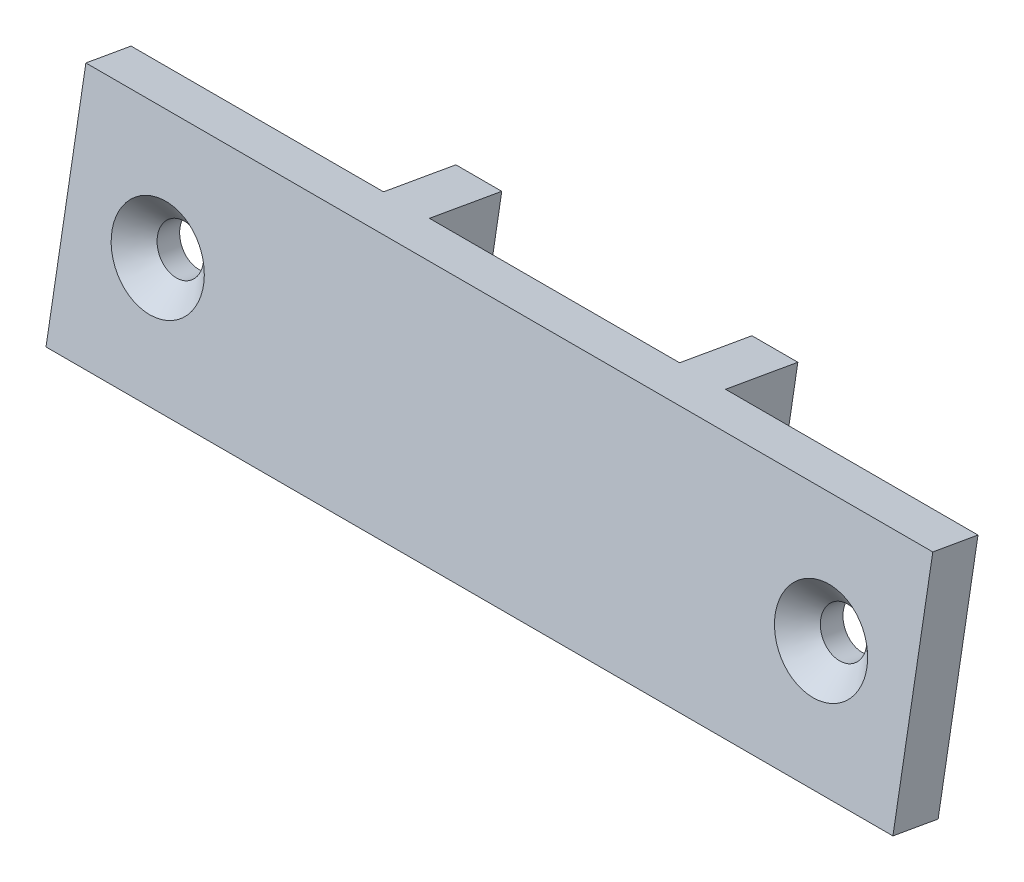
ISO-10303-21;
HEADER;
FILE_DESCRIPTION(('STEP AP214'),'2;1');
FILE_NAME('part.step','',(''),(''),'','','');
FILE_SCHEMA(('AUTOMOTIVE_DESIGN { 1 0 10303 214 1 1 1 1 }'));
ENDSEC;
DATA;
#1=APPLICATION_CONTEXT('core data for automotive mechanical design processes');
#2=APPLICATION_PROTOCOL_DEFINITION('international standard','automotive_design',2000,#1);
#3=PRODUCT_CONTEXT('',#1,'mechanical');
#4=PRODUCT('Part','Part','',(#3));
#5=PRODUCT_RELATED_PRODUCT_CATEGORY('part','',(#4));
#6=PRODUCT_DEFINITION_FORMATION('','',#4);
#7=PRODUCT_DEFINITION_CONTEXT('part definition',#1,'design');
#8=PRODUCT_DEFINITION('design','',#6,#7);
#9=PRODUCT_DEFINITION_SHAPE('','',#8);
#10=(LENGTH_UNIT() NAMED_UNIT(*) SI_UNIT(.MILLI.,.METRE.));
#11=(NAMED_UNIT(*) PLANE_ANGLE_UNIT() SI_UNIT($,.RADIAN.));
#12=(NAMED_UNIT(*) SI_UNIT($,.STERADIAN.) SOLID_ANGLE_UNIT());
#13=UNCERTAINTY_MEASURE_WITH_UNIT(LENGTH_MEASURE(1.E-05),#10,'distance_accuracy_value','');
#14=(GEOMETRIC_REPRESENTATION_CONTEXT(3) GLOBAL_UNCERTAINTY_ASSIGNED_CONTEXT((#13)) GLOBAL_UNIT_ASSIGNED_CONTEXT((#10,
#11,#12)) REPRESENTATION_CONTEXT('',''));
#15=CARTESIAN_POINT('',(0.,0.,0.));
#16=DIRECTION('',(0.,0.,1.));
#17=DIRECTION('',(1.,0.,0.));
#18=AXIS2_PLACEMENT_3D('',#15,#16,#17);
#19=CARTESIAN_POINT('',(0.,-1.580198416769,-8.96175055241111));
#20=DIRECTION('',(0.,0.173648177666923,0.984807753012209));
#21=DIRECTION('',(0.,-0.984807753012209,0.173648177666923));
#22=AXIS2_PLACEMENT_3D('',#19,#20,#21);
#23=PLANE('',#22);
#24=CARTESIAN_POINT('',(14.45,6.88914825913601,-10.4551248803466));
#25=DIRECTION('',(0.,0.173648177666923,0.984807753012209));
#26=DIRECTION('',(0.,-0.984807753012209,0.173648177666923));
#27=AXIS2_PLACEMENT_3D('',#24,#25,#26);
#28=CIRCLE('',#27,1.);
#29=CARTESIAN_POINT('',(14.45,5.9043405061238,-10.2814767026797));
#30=VERTEX_POINT('',#29);
#31=EDGE_CURVE('E197',#30,#30,#28,.T.);
#32=ORIENTED_EDGE('',*,*,#31,.T.);
#33=EDGE_LOOP('',(#32));
#34=FACE_BOUND('',#33,.T.);
#35=DIRECTION('',(0.,-0.984807753012209,0.173648177666923));
#36=VECTOR('',#35,1.);
#37=CARTESIAN_POINT('',(7.45,11.8131870241971,-11.3233657686813));
#38=LINE('',#37,#36);
#39=CARTESIAN_POINT('',(7.45,11.8131870241971,-11.3233657686813));
#40=VERTEX_POINT('',#39);
#41=CARTESIAN_POINT('',(7.45,1.96510949407496,-9.58688399201203));
#42=VERTEX_POINT('',#41);
#43=EDGE_CURVE('E162',#40,#42,#38,.T.);
#44=ORIENTED_EDGE('',*,*,#43,.F.);
#45=DIRECTION('',(-1.,0.,0.));
#46=VECTOR('',#45,1.);
#47=CARTESIAN_POINT('',(-18.45,11.8131870241971,-11.3233657686813));
#48=LINE('',#47,#46);
#49=CARTESIAN_POINT('',(18.45,11.8131870241971,-11.3233657686813));
#50=VERTEX_POINT('',#49);
#51=EDGE_CURVE('E214',#50,#40,#48,.T.);
#52=ORIENTED_EDGE('',*,*,#51,.F.);
#53=DIRECTION('',(0.,0.984807753012209,-0.173648177666923));
#54=VECTOR('',#53,1.);
#55=CARTESIAN_POINT('',(18.45,11.8131870241971,-11.3233657686813));
#56=LINE('',#55,#54);
#57=CARTESIAN_POINT('',(18.45,1.96510949407496,-9.58688399201203));
#58=VERTEX_POINT('',#57);
#59=EDGE_CURVE('E209',#58,#50,#56,.T.);
#60=ORIENTED_EDGE('',*,*,#59,.F.);
#61=DIRECTION('',(1.,0.,0.));
#62=VECTOR('',#61,1.);
#63=CARTESIAN_POINT('',(-18.45,1.96510949407496,-9.58688399201203));
#64=LINE('',#63,#62);
#65=EDGE_CURVE('E57',#42,#58,#64,.T.);
#66=ORIENTED_EDGE('',*,*,#65,.F.);
#67=EDGE_LOOP('',(#44,#52,#60,#66));
#68=FACE_BOUND('',#67,.T.);
#69=ADVANCED_FACE('F41',(#34,#68),#23,.F.);
#70=DIRECTION('',(0.,0.984807753012209,-0.173648177666923));
#71=VECTOR('',#70,1.);
#72=CARTESIAN_POINT('',(5.45,11.8131870241971,-11.3233657686813));
#73=LINE('',#72,#71);
#74=CARTESIAN_POINT('',(5.45,1.96510949407496,-9.58688399201203));
#75=VERTEX_POINT('',#74);
#76=CARTESIAN_POINT('',(5.45,11.8131870241971,-11.3233657686813));
#77=VERTEX_POINT('',#76);
#78=EDGE_CURVE('E65',#75,#77,#73,.T.);
#79=ORIENTED_EDGE('',*,*,#78,.F.);
#80=CARTESIAN_POINT('',(-5.45,1.96510949407496,-9.58688399201203));
#81=VERTEX_POINT('',#80);
#82=EDGE_CURVE('E210',#81,#75,#64,.T.);
#83=ORIENTED_EDGE('',*,*,#82,.F.);
#84=DIRECTION('',(0.,-0.984807753012209,0.173648177666923));
#85=VECTOR('',#84,1.);
#86=CARTESIAN_POINT('',(-5.45,1.96510949407496,-9.58688399201203));
#87=LINE('',#86,#85);
#88=CARTESIAN_POINT('',(-5.45,11.8131870241971,-11.3233657686813));
#89=VERTEX_POINT('',#88);
#90=EDGE_CURVE('E178',#89,#81,#87,.T.);
#91=ORIENTED_EDGE('',*,*,#90,.F.);
#92=EDGE_CURVE('E216',#77,#89,#48,.T.);
#93=ORIENTED_EDGE('',*,*,#92,.F.);
#94=EDGE_LOOP('',(#79,#83,#91,#93));
#95=FACE_BOUND('',#94,.T.);
#96=ADVANCED_FACE('F255',(#95),#23,.F.);
#97=CARTESIAN_POINT('',(-14.45,6.889148259136,-10.4551248803466));
#98=DIRECTION('',(0.,0.173648177666923,0.984807753012209));
#99=DIRECTION('',(0.,-0.984807753012209,0.173648177666923));
#100=AXIS2_PLACEMENT_3D('',#97,#98,#99);
#101=CIRCLE('',#100,1.);
#102=CARTESIAN_POINT('',(-14.45,5.90434050612379,-10.2814767026797));
#103=VERTEX_POINT('',#102);
#104=EDGE_CURVE('E278',#103,#103,#101,.F.);
#105=ORIENTED_EDGE('',*,*,#104,.F.);
#106=EDGE_LOOP('',(#105));
#107=FACE_BOUND('',#106,.T.);
#108=DIRECTION('',(0.,0.984807753012209,-0.173648177666923));
#109=VECTOR('',#108,1.);
#110=CARTESIAN_POINT('',(-7.45,1.96510949407496,-9.58688399201203));
#111=LINE('',#110,#109);
#112=CARTESIAN_POINT('',(-7.45,1.96510949407496,-9.58688399201203));
#113=VERTEX_POINT('',#112);
#114=CARTESIAN_POINT('',(-7.45,11.8131870241971,-11.3233657686813));
#115=VERTEX_POINT('',#114);
#116=EDGE_CURVE('E174',#113,#115,#111,.T.);
#117=ORIENTED_EDGE('',*,*,#116,.F.);
#118=CARTESIAN_POINT('',(-18.45,1.96510949407496,-9.58688399201203));
#119=VERTEX_POINT('',#118);
#120=EDGE_CURVE('E206',#119,#113,#64,.T.);
#121=ORIENTED_EDGE('',*,*,#120,.F.);
#122=DIRECTION('',(0.,-0.984807753012209,0.173648177666923));
#123=VECTOR('',#122,1.);
#124=CARTESIAN_POINT('',(-18.45,11.8131870241971,-11.3233657686813));
#125=LINE('',#124,#123);
#126=CARTESIAN_POINT('',(-18.45,11.8131870241971,-11.3233657686813));
#127=VERTEX_POINT('',#126);
#128=EDGE_CURVE('E202',#127,#119,#125,.T.);
#129=ORIENTED_EDGE('',*,*,#128,.F.);
#130=EDGE_CURVE('E213',#115,#127,#48,.T.);
#131=ORIENTED_EDGE('',*,*,#130,.F.);
#132=EDGE_LOOP('',(#117,#121,#129,#131));
#133=FACE_BOUND('',#132,.T.);
#134=ADVANCED_FACE('F258',(#107,#133),#23,.F.);
#135=CARTESIAN_POINT('',(-18.45,11.8131870241971,-11.3233657686813));
#136=DIRECTION('',(-1.,0.,0.));
#137=DIRECTION('',(0.,0.,1.));
#138=AXIS2_PLACEMENT_3D('',#135,#136,#137);
#139=PLANE('',#138);
#140=DIRECTION('',(0.,-0.984807753012209,0.173648177666923));
#141=VECTOR('',#140,1.);
#142=CARTESIAN_POINT('',(-18.45,12.1604833795309,-9.35375026265685));
#143=LINE('',#142,#141);
#144=CARTESIAN_POINT('',(-18.45,12.1604833795309,-9.35375026265685));
#145=VERTEX_POINT('',#144);
#146=CARTESIAN_POINT('',(-18.45,2.31240584940881,-7.61726848598761));
#147=VERTEX_POINT('',#146);
#148=EDGE_CURVE('E155',#145,#147,#143,.T.);
#149=ORIENTED_EDGE('',*,*,#148,.F.);
#150=DIRECTION('',(0.,0.173648177666923,0.984807753012209));
#151=VECTOR('',#150,1.);
#152=CARTESIAN_POINT('',(-18.45,11.8131870241971,-11.3233657686813));
#153=LINE('',#152,#151);
#154=EDGE_CURVE('E225',#127,#145,#153,.T.);
#155=ORIENTED_EDGE('',*,*,#154,.F.);
#156=ORIENTED_EDGE('',*,*,#128,.T.);
#157=DIRECTION('',(0.,0.173648177666923,0.984807753012209));
#158=VECTOR('',#157,1.);
#159=CARTESIAN_POINT('',(-18.45,1.96510949407496,-9.58688399201203));
#160=LINE('',#159,#158);
#161=EDGE_CURVE('E215',#119,#147,#160,.T.);
#162=ORIENTED_EDGE('',*,*,#161,.T.);
#163=EDGE_LOOP('',(#149,#155,#156,#162));
#164=FACE_BOUND('',#163,.T.);
#165=ADVANCED_FACE('F267',(#164),#139,.T.);
#166=CARTESIAN_POINT('',(-18.45,11.8131870241971,-11.3233657686813));
#167=DIRECTION('',(0.,0.984807753012209,-0.173648177666923));
#168=DIRECTION('',(0.,0.173648177666923,0.984807753012209));
#169=AXIS2_PLACEMENT_3D('',#166,#167,#168);
#170=PLANE('',#169);
#171=DIRECTION('',(-1.,0.,0.));
#172=VECTOR('',#171,1.);
#173=CARTESIAN_POINT('',(-18.45,12.1604833795309,-9.35375026265685));
#174=LINE('',#173,#172);
#175=CARTESIAN_POINT('',(18.45,12.1604833795309,-9.35375026265685));
#176=VERTEX_POINT('',#175);
#177=EDGE_CURVE('E205',#176,#145,#174,.T.);
#178=ORIENTED_EDGE('',*,*,#177,.F.);
#179=DIRECTION('',(0.,0.173648177666923,0.984807753012209));
#180=VECTOR('',#179,1.);
#181=CARTESIAN_POINT('',(18.45,11.8131870241971,-11.3233657686813));
#182=LINE('',#181,#180);
#183=EDGE_CURVE('E228',#50,#176,#182,.T.);
#184=ORIENTED_EDGE('',*,*,#183,.F.);
#185=ORIENTED_EDGE('',*,*,#51,.T.);
#186=DIRECTION('',(0.,0.173648177666923,0.984807753012209));
#187=VECTOR('',#186,1.);
#188=CARTESIAN_POINT('',(7.45,9.22616969631558,-25.9950701073321));
#189=LINE('',#188,#187);
#190=CARTESIAN_POINT('',(7.45,11.2575128556629,-14.4747505783203));
#191=VERTEX_POINT('',#190);
#192=EDGE_CURVE('E146',#191,#40,#189,.T.);
#193=ORIENTED_EDGE('',*,*,#192,.F.);
#194=DIRECTION('',(1.,0.,0.));
#195=VECTOR('',#194,1.);
#196=CARTESIAN_POINT('',(7.45,11.2575128556629,-14.4747505783203));
#197=LINE('',#196,#195);
#198=CARTESIAN_POINT('',(5.45,11.2575128556629,-14.4747505783203));
#199=VERTEX_POINT('',#198);
#200=EDGE_CURVE('E139',#199,#191,#197,.T.);
#201=ORIENTED_EDGE('',*,*,#200,.F.);
#202=DIRECTION('',(0.,0.173648177666923,0.984807753012209));
#203=VECTOR('',#202,1.);
#204=CARTESIAN_POINT('',(5.45,9.22616969631558,-25.9950701073321));
#205=LINE('',#204,#203);
#206=EDGE_CURVE('E130',#199,#77,#205,.T.);
#207=ORIENTED_EDGE('',*,*,#206,.T.);
#208=ORIENTED_EDGE('',*,*,#92,.T.);
#209=DIRECTION('',(0.,0.173648177666923,0.984807753012209));
#210=VECTOR('',#209,1.);
#211=CARTESIAN_POINT('',(-5.45,9.22616969631558,-25.9950701073321));
#212=LINE('',#211,#210);
#213=CARTESIAN_POINT('',(-5.45,11.2575128556629,-14.4747505783203));
#214=VERTEX_POINT('',#213);
#215=EDGE_CURVE('E180',#214,#89,#212,.T.);
#216=ORIENTED_EDGE('',*,*,#215,.F.);
#217=DIRECTION('',(1.,0.,0.));
#218=VECTOR('',#217,1.);
#219=CARTESIAN_POINT('',(-7.45,11.2575128556629,-14.4747505783203));
#220=LINE('',#219,#218);
#221=CARTESIAN_POINT('',(-7.45,11.2575128556629,-14.4747505783203));
#222=VERTEX_POINT('',#221);
#223=EDGE_CURVE('E191',#222,#214,#220,.T.);
#224=ORIENTED_EDGE('',*,*,#223,.F.);
#225=DIRECTION('',(0.,0.173648177666923,0.984807753012209));
#226=VECTOR('',#225,1.);
#227=CARTESIAN_POINT('',(-7.45,9.22616969631558,-25.9950701073321));
#228=LINE('',#227,#226);
#229=EDGE_CURVE('E183',#222,#115,#228,.T.);
#230=ORIENTED_EDGE('',*,*,#229,.T.);
#231=ORIENTED_EDGE('',*,*,#130,.T.);
#232=ORIENTED_EDGE('',*,*,#154,.T.);
#233=EDGE_LOOP('',(#178,#184,#185,#193,#201,#207,#208,#216,#224,#230,#231,#232));
#234=FACE_BOUND('',#233,.T.);
#235=ADVANCED_FACE('F143',(#234),#170,.T.);
#236=CARTESIAN_POINT('',(18.45,11.8131870241971,-11.3233657686813));
#237=DIRECTION('',(1.,0.,0.));
#238=DIRECTION('',(0.,0.,-1.));
#239=AXIS2_PLACEMENT_3D('',#236,#237,#238);
#240=PLANE('',#239);
#241=DIRECTION('',(0.,0.984807753012209,-0.173648177666923));
#242=VECTOR('',#241,1.);
#243=CARTESIAN_POINT('',(18.45,12.1604833795309,-9.35375026265685));
#244=LINE('',#243,#242);
#245=CARTESIAN_POINT('',(18.45,2.31240584940881,-7.61726848598761));
#246=VERTEX_POINT('',#245);
#247=EDGE_CURVE('E220',#246,#176,#244,.T.);
#248=ORIENTED_EDGE('',*,*,#247,.F.);
#249=DIRECTION('',(0.,0.173648177666923,0.984807753012209));
#250=VECTOR('',#249,1.);
#251=CARTESIAN_POINT('',(18.45,1.96510949407496,-9.58688399201203));
#252=LINE('',#251,#250);
#253=EDGE_CURVE('E230',#58,#246,#252,.T.);
#254=ORIENTED_EDGE('',*,*,#253,.F.);
#255=ORIENTED_EDGE('',*,*,#59,.T.);
#256=ORIENTED_EDGE('',*,*,#183,.T.);
#257=EDGE_LOOP('',(#248,#254,#255,#256));
#258=FACE_BOUND('',#257,.T.);
#259=ADVANCED_FACE('F301',(#258),#240,.T.);
#260=CARTESIAN_POINT('',(-18.45,1.96510949407496,-9.58688399201203));
#261=DIRECTION('',(0.,-0.984807753012209,0.173648177666923));
#262=DIRECTION('',(0.,-0.173648177666923,-0.984807753012209));
#263=AXIS2_PLACEMENT_3D('',#260,#261,#262);
#264=PLANE('',#263);
#265=DIRECTION('',(1.,0.,0.));
#266=VECTOR('',#265,1.);
#267=CARTESIAN_POINT('',(-18.45,2.31240584940881,-7.61726848598761));
#268=LINE('',#267,#266);
#269=EDGE_CURVE('E158',#147,#246,#268,.T.);
#270=ORIENTED_EDGE('',*,*,#269,.F.);
#271=ORIENTED_EDGE('',*,*,#161,.F.);
#272=ORIENTED_EDGE('',*,*,#120,.T.);
#273=DIRECTION('',(0.,0.173648177666923,0.984807753012209));
#274=VECTOR('',#273,1.);
#275=CARTESIAN_POINT('',(-7.45,-0.621907833806521,-24.2585883306629));
#276=LINE('',#275,#274);
#277=CARTESIAN_POINT('',(-7.45,1.4094353255408,-12.7382688016511));
#278=VERTEX_POINT('',#277);
#279=EDGE_CURVE('E171',#278,#113,#276,.T.);
#280=ORIENTED_EDGE('',*,*,#279,.F.);
#281=DIRECTION('',(-1.,0.,0.));
#282=VECTOR('',#281,1.);
#283=CARTESIAN_POINT('',(-7.45,1.4094353255408,-12.7382688016511));
#284=LINE('',#283,#282);
#285=CARTESIAN_POINT('',(-5.45,1.4094353255408,-12.7382688016511));
#286=VERTEX_POINT('',#285);
#287=EDGE_CURVE('E179',#286,#278,#284,.T.);
#288=ORIENTED_EDGE('',*,*,#287,.F.);
#289=DIRECTION('',(0.,0.173648177666923,0.984807753012209));
#290=VECTOR('',#289,1.);
#291=CARTESIAN_POINT('',(-5.45,-0.621907833806523,-24.2585883306629));
#292=LINE('',#291,#290);
#293=EDGE_CURVE('E175',#286,#81,#292,.T.);
#294=ORIENTED_EDGE('',*,*,#293,.T.);
#295=ORIENTED_EDGE('',*,*,#82,.T.);
#296=DIRECTION('',(0.,0.173648177666923,0.984807753012209));
#297=VECTOR('',#296,1.);
#298=CARTESIAN_POINT('',(5.45,-0.621907833806523,-24.2585883306629));
#299=LINE('',#298,#297);
#300=CARTESIAN_POINT('',(5.45,1.4094353255408,-12.7382688016511));
#301=VERTEX_POINT('',#300);
#302=EDGE_CURVE('E168',#301,#75,#299,.T.);
#303=ORIENTED_EDGE('',*,*,#302,.F.);
#304=DIRECTION('',(-1.,0.,0.));
#305=VECTOR('',#304,1.);
#306=CARTESIAN_POINT('',(7.45,1.4094353255408,-12.7382688016511));
#307=LINE('',#306,#305);
#308=CARTESIAN_POINT('',(7.45,1.4094353255408,-12.7382688016511));
#309=VERTEX_POINT('',#308);
#310=EDGE_CURVE('E154',#309,#301,#307,.T.);
#311=ORIENTED_EDGE('',*,*,#310,.F.);
#312=DIRECTION('',(0.,0.173648177666923,0.984807753012209));
#313=VECTOR('',#312,1.);
#314=CARTESIAN_POINT('',(7.45,-0.621907833806524,-24.2585883306629));
#315=LINE('',#314,#313);
#316=EDGE_CURVE('E166',#309,#42,#315,.T.);
#317=ORIENTED_EDGE('',*,*,#316,.T.);
#318=ORIENTED_EDGE('',*,*,#65,.T.);
#319=ORIENTED_EDGE('',*,*,#253,.T.);
#320=EDGE_LOOP('',(#270,#271,#272,#280,#288,#294,#295,#303,#311,#317,#318,#319));
#321=FACE_BOUND('',#320,.T.);
#322=ADVANCED_FACE('F285',(#321),#264,.T.);
#323=CARTESIAN_POINT('',(0.,-1.23290206143516,-6.99213504638669));
#324=DIRECTION('',(0.,0.173648177666923,0.984807753012209));
#325=DIRECTION('',(0.,-0.984807753012209,0.173648177666923));
#326=AXIS2_PLACEMENT_3D('',#323,#324,#325);
#327=PLANE('',#326);
#328=CARTESIAN_POINT('',(-14.45,7.23644461446985,-8.48550937432223));
#329=DIRECTION('',(0.,0.173648177666923,0.984807753012209));
#330=DIRECTION('',(0.,-0.984807753012209,0.173648177666923));
#331=AXIS2_PLACEMENT_3D('',#328,#329,#330);
#332=CIRCLE('',#331,2.00000000000002);
#333=CARTESIAN_POINT('',(-14.45,5.26682910844541,-8.13821301898838));
#334=VERTEX_POINT('',#333);
#335=EDGE_CURVE('E50',#334,#334,#332,.F.);
#336=ORIENTED_EDGE('',*,*,#335,.T.);
#337=EDGE_LOOP('',(#336));
#338=FACE_BOUND('',#337,.T.);
#339=CARTESIAN_POINT('',(14.45,7.23644461446985,-8.48550937432223));
#340=DIRECTION('',(0.,0.173648177666923,0.984807753012209));
#341=DIRECTION('',(0.,-0.984807753012209,0.173648177666923));
#342=AXIS2_PLACEMENT_3D('',#339,#340,#341);
#343=CIRCLE('',#342,2.00000000000003);
#344=CARTESIAN_POINT('',(14.45,5.26682910844541,-8.13821301898838));
#345=VERTEX_POINT('',#344);
#346=EDGE_CURVE('E235',#345,#345,#343,.F.);
#347=ORIENTED_EDGE('',*,*,#346,.T.);
#348=EDGE_LOOP('',(#347));
#349=FACE_BOUND('',#348,.T.);
#350=ORIENTED_EDGE('',*,*,#148,.T.);
#351=ORIENTED_EDGE('',*,*,#269,.T.);
#352=ORIENTED_EDGE('',*,*,#247,.T.);
#353=ORIENTED_EDGE('',*,*,#177,.T.);
#354=EDGE_LOOP('',(#350,#351,#352,#353));
#355=FACE_BOUND('',#354,.T.);
#356=ADVANCED_FACE('F240',(#338,#349,#355),#327,.T.);
#357=CARTESIAN_POINT('',(-7.45,-0.621907833806521,-24.2585883306629));
#358=DIRECTION('',(1.,0.,0.));
#359=DIRECTION('',(0.,1.,0.));
#360=AXIS2_PLACEMENT_3D('',#357,#358,#359);
#361=PLANE('',#360);
#362=DIRECTION('',(0.,0.984807753012209,-0.173648177666923));
#363=VECTOR('',#362,1.);
#364=CARTESIAN_POINT('',(-7.45,1.4094353255408,-12.7382688016511));
#365=LINE('',#364,#363);
#366=EDGE_CURVE('E188',#278,#222,#365,.T.);
#367=ORIENTED_EDGE('',*,*,#366,.F.);
#368=ORIENTED_EDGE('',*,*,#279,.T.);
#369=ORIENTED_EDGE('',*,*,#116,.T.);
#370=ORIENTED_EDGE('',*,*,#229,.F.);
#371=EDGE_LOOP('',(#367,#368,#369,#370));
#372=FACE_BOUND('',#371,.T.);
#373=ADVANCED_FACE('F288',(#372),#361,.F.);
#374=CARTESIAN_POINT('',(-5.45,-0.621907833806523,-24.2585883306629));
#375=DIRECTION('',(-1.,0.,0.));
#376=DIRECTION('',(0.,-1.,0.));
#377=AXIS2_PLACEMENT_3D('',#374,#375,#376);
#378=PLANE('',#377);
#379=DIRECTION('',(0.,-0.984807753012209,0.173648177666923));
#380=VECTOR('',#379,1.);
#381=CARTESIAN_POINT('',(-5.45,1.4094353255408,-12.7382688016511));
#382=LINE('',#381,#380);
#383=EDGE_CURVE('E194',#214,#286,#382,.T.);
#384=ORIENTED_EDGE('',*,*,#383,.F.);
#385=ORIENTED_EDGE('',*,*,#215,.T.);
#386=ORIENTED_EDGE('',*,*,#90,.T.);
#387=ORIENTED_EDGE('',*,*,#293,.F.);
#388=EDGE_LOOP('',(#384,#385,#386,#387));
#389=FACE_BOUND('',#388,.T.);
#390=ADVANCED_FACE('F292',(#389),#378,.F.);
#391=CARTESIAN_POINT('',(-10.45,-21.3888641566918,-8.71831348866182));
#392=DIRECTION('',(0.,-0.173648177666923,-0.984807753012209));
#393=DIRECTION('',(0.,0.984807753012209,-0.173648177666923));
#394=AXIS2_PLACEMENT_3D('',#391,#392,#393);
#395=PLANE('',#394);
#396=ORIENTED_EDGE('',*,*,#287,.T.);
#397=ORIENTED_EDGE('',*,*,#366,.T.);
#398=ORIENTED_EDGE('',*,*,#223,.T.);
#399=ORIENTED_EDGE('',*,*,#383,.T.);
#400=EDGE_LOOP('',(#396,#397,#398,#399));
#401=FACE_BOUND('',#400,.T.);
#402=ADVANCED_FACE('F290',(#401),#395,.T.);
#403=CARTESIAN_POINT('',(7.45,9.22616969631558,-25.9950701073321));
#404=DIRECTION('',(-1.,0.,0.));
#405=DIRECTION('',(0.,-1.,0.));
#406=AXIS2_PLACEMENT_3D('',#403,#404,#405);
#407=PLANE('',#406);
#408=DIRECTION('',(0.,-0.984807753012209,0.173648177666923));
#409=VECTOR('',#408,1.);
#410=CARTESIAN_POINT('',(7.45,11.2575128556629,-14.4747505783203));
#411=LINE('',#410,#409);
#412=EDGE_CURVE('E150',#191,#309,#411,.T.);
#413=ORIENTED_EDGE('',*,*,#412,.F.);
#414=ORIENTED_EDGE('',*,*,#192,.T.);
#415=ORIENTED_EDGE('',*,*,#43,.T.);
#416=ORIENTED_EDGE('',*,*,#316,.F.);
#417=EDGE_LOOP('',(#413,#414,#415,#416));
#418=FACE_BOUND('',#417,.T.);
#419=ADVANCED_FACE('F305',(#418),#407,.F.);
#420=CARTESIAN_POINT('',(5.45,9.22616969631558,-25.9950701073321));
#421=DIRECTION('',(1.,0.,0.));
#422=DIRECTION('',(0.,1.,0.));
#423=AXIS2_PLACEMENT_3D('',#420,#421,#422);
#424=PLANE('',#423);
#425=DIRECTION('',(0.,0.984807753012209,-0.173648177666923));
#426=VECTOR('',#425,1.);
#427=CARTESIAN_POINT('',(5.45,11.2575128556629,-14.4747505783203));
#428=LINE('',#427,#426);
#429=EDGE_CURVE('E135',#301,#199,#428,.T.);
#430=ORIENTED_EDGE('',*,*,#429,.F.);
#431=ORIENTED_EDGE('',*,*,#302,.T.);
#432=ORIENTED_EDGE('',*,*,#78,.T.);
#433=ORIENTED_EDGE('',*,*,#206,.F.);
#434=EDGE_LOOP('',(#430,#431,#432,#433));
#435=FACE_BOUND('',#434,.T.);
#436=ADVANCED_FACE('F132',(#435),#424,.F.);
#437=CARTESIAN_POINT('',(-10.45,-21.3888641566918,-8.71831348866182));
#438=DIRECTION('',(0.,-0.173648177666923,-0.984807753012209));
#439=DIRECTION('',(0.,0.984807753012209,-0.173648177666923));
#440=AXIS2_PLACEMENT_3D('',#437,#438,#439);
#441=PLANE('',#440);
#442=ORIENTED_EDGE('',*,*,#200,.T.);
#443=ORIENTED_EDGE('',*,*,#412,.T.);
#444=ORIENTED_EDGE('',*,*,#310,.T.);
#445=ORIENTED_EDGE('',*,*,#429,.T.);
#446=EDGE_LOOP('',(#442,#443,#444,#445));
#447=FACE_BOUND('',#446,.T.);
#448=ADVANCED_FACE('F153',(#447),#441,.T.);
#449=CARTESIAN_POINT('',(14.45,-3.77074927897298,-70.9104079872143));
#450=DIRECTION('',(0.,0.173648177666923,0.984807753012209));
#451=DIRECTION('',(0.,-0.984807753012209,0.173648177666923));
#452=AXIS2_PLACEMENT_3D('',#449,#450,#451);
#453=CYLINDRICAL_SURFACE('',#452,1.);
#454=CARTESIAN_POINT('',(14.45,7.06279643680292,-9.47031712733448));
#455=DIRECTION('',(0.,0.173648177666923,0.984807753012209));
#456=DIRECTION('',(0.,-0.984807753012209,0.173648177666923));
#457=AXIS2_PLACEMENT_3D('',#454,#455,#456);
#458=CIRCLE('',#457,1.);
#459=CARTESIAN_POINT('',(14.45,6.07798868379071,-9.29666894966755));
#460=VERTEX_POINT('',#459);
#461=EDGE_CURVE('E227',#460,#460,#458,.T.);
#462=ORIENTED_EDGE('',*,*,#461,.T.);
#463=EDGE_LOOP('',(#462));
#464=FACE_BOUND('',#463,.T.);
#465=ORIENTED_EDGE('',*,*,#31,.F.);
#466=EDGE_LOOP('',(#465));
#467=FACE_BOUND('',#466,.T.);
#468=ADVANCED_FACE('F318',(#464,#467),#453,.F.);
#469=CARTESIAN_POINT('',(14.45,7.06279643680292,-9.47031712733447));
#470=DIRECTION('',(0.,0.173648177666923,0.984807753012209));
#471=DIRECTION('',(0.,-0.984807753012209,0.173648177666923));
#472=AXIS2_PLACEMENT_3D('',#469,#470,#471);
#473=CONICAL_SURFACE('',#472,1.,0.785398163397446);
#474=ORIENTED_EDGE('',*,*,#346,.F.);
#475=EDGE_LOOP('',(#474));
#476=FACE_BOUND('',#475,.T.);
#477=ORIENTED_EDGE('',*,*,#461,.F.);
#478=EDGE_LOOP('',(#477));
#479=FACE_BOUND('',#478,.T.);
#480=ADVANCED_FACE('F250',(#476,#479),#473,.F.);
#481=CARTESIAN_POINT('',(-14.45,6.03651821753245,-15.290630134153));
#482=DIRECTION('',(0.,0.173648177666923,0.984807753012209));
#483=DIRECTION('',(0.,-0.984807753012209,0.173648177666923));
#484=AXIS2_PLACEMENT_3D('',#481,#482,#483);
#485=CYLINDRICAL_SURFACE('',#484,1.);
#486=CARTESIAN_POINT('',(-14.45,7.06279643680293,-9.47031712733445));
#487=DIRECTION('',(0.,0.173648177666924,0.984807753012209));
#488=DIRECTION('',(0.,-0.984807753012209,0.173648177666924));
#489=AXIS2_PLACEMENT_3D('',#486,#487,#488);
#490=CIRCLE('',#489,1.);
#491=CARTESIAN_POINT('',(-14.45,6.07798868379072,-9.29666894966752));
#492=VERTEX_POINT('',#491);
#493=EDGE_CURVE('E11',#492,#492,#490,.T.);
#494=ORIENTED_EDGE('',*,*,#493,.T.);
#495=EDGE_LOOP('',(#494));
#496=FACE_BOUND('',#495,.T.);
#497=ORIENTED_EDGE('',*,*,#104,.T.);
#498=EDGE_LOOP('',(#497));
#499=FACE_BOUND('',#498,.T.);
#500=ADVANCED_FACE('F244',(#496,#499),#485,.F.);
#501=CARTESIAN_POINT('',(-14.45,7.23644461446985,-8.48550937432223));
#502=DIRECTION('',(0.,0.173648177666924,0.984807753012209));
#503=DIRECTION('',(0.,-0.984807753012209,0.173648177666924));
#504=AXIS2_PLACEMENT_3D('',#501,#502,#503);
#505=CONICAL_SURFACE('',#504,2.00000000000002,0.785398163397454);
#506=ORIENTED_EDGE('',*,*,#493,.F.);
#507=EDGE_LOOP('',(#506));
#508=FACE_BOUND('',#507,.T.);
#509=ORIENTED_EDGE('',*,*,#335,.F.);
#510=EDGE_LOOP('',(#509));
#511=FACE_BOUND('',#510,.T.);
#512=ADVANCED_FACE('F44',(#508,#511),#505,.F.);
#513=CLOSED_SHELL('',(#69,#96,#134,#165,#235,#259,#322,#356,#373,#390,#402,#419,#436,#448,#468,
#480,#500,#512));
#514=MANIFOLD_SOLID_BREP('B2',#513);
#515=ADVANCED_BREP_SHAPE_REPRESENTATION('',(#18,#514),#14);
#516=SHAPE_DEFINITION_REPRESENTATION(#9,#515);
ENDSEC;
END-ISO-10303-21;
